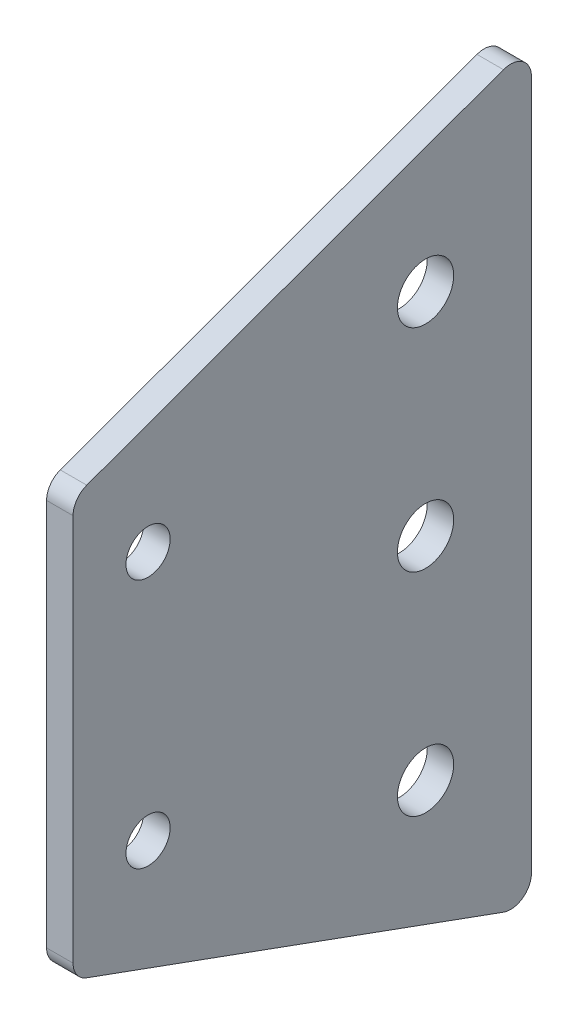
ISO-10303-21;
HEADER;
FILE_DESCRIPTION(('STEP AP214'),'2;1');
FILE_NAME('part.step','',(''),(''),'','','');
FILE_SCHEMA(('AUTOMOTIVE_DESIGN { 1 0 10303 214 1 1 1 1 }'));
ENDSEC;
DATA;
#1=APPLICATION_CONTEXT('core data for automotive mechanical design processes');
#2=APPLICATION_PROTOCOL_DEFINITION('international standard','automotive_design',2000,#1);
#3=PRODUCT_CONTEXT('',#1,'mechanical');
#4=PRODUCT('Part','Part','',(#3));
#5=PRODUCT_RELATED_PRODUCT_CATEGORY('part','',(#4));
#6=PRODUCT_DEFINITION_FORMATION('','',#4);
#7=PRODUCT_DEFINITION_CONTEXT('part definition',#1,'design');
#8=PRODUCT_DEFINITION('design','',#6,#7);
#9=PRODUCT_DEFINITION_SHAPE('','',#8);
#10=(LENGTH_UNIT() NAMED_UNIT(*) SI_UNIT(.MILLI.,.METRE.));
#11=(NAMED_UNIT(*) PLANE_ANGLE_UNIT() SI_UNIT($,.RADIAN.));
#12=(NAMED_UNIT(*) SI_UNIT($,.STERADIAN.) SOLID_ANGLE_UNIT());
#13=UNCERTAINTY_MEASURE_WITH_UNIT(LENGTH_MEASURE(1.E-05),#10,'distance_accuracy_value','');
#14=(GEOMETRIC_REPRESENTATION_CONTEXT(3) GLOBAL_UNCERTAINTY_ASSIGNED_CONTEXT((#13)) GLOBAL_UNIT_ASSIGNED_CONTEXT((#10,
#11,#12)) REPRESENTATION_CONTEXT('',''));
#15=CARTESIAN_POINT('',(0.,0.,0.));
#16=DIRECTION('',(0.,0.,1.));
#17=DIRECTION('',(1.,0.,0.));
#18=AXIS2_PLACEMENT_3D('',#15,#16,#17);
#19=CARTESIAN_POINT('',(1.5875,0.,0.));
#20=DIRECTION('',(-1.,0.,0.));
#21=DIRECTION('',(0.,0.,1.));
#22=AXIS2_PLACEMENT_3D('',#19,#20,#21);
#23=PLANE('',#22);
#24=CARTESIAN_POINT('',(1.5875,25.4,-14.8));
#25=DIRECTION('',(1.,0.,0.));
#26=DIRECTION('',(0.,0.,-1.));
#27=AXIS2_PLACEMENT_3D('',#24,#25,#26);
#28=CIRCLE('',#27,3.3782);
#29=CARTESIAN_POINT('',(1.5875,25.4,-18.1782));
#30=VERTEX_POINT('',#29);
#31=EDGE_CURVE('E415',#30,#30,#28,.T.);
#32=ORIENTED_EDGE('',*,*,#31,.F.);
#33=EDGE_LOOP('',(#32));
#34=FACE_BOUND('',#33,.T.);
#35=CARTESIAN_POINT('',(1.5875,15.,18.5));
#36=DIRECTION('',(1.,0.,0.));
#37=DIRECTION('',(0.,0.,-1.));
#38=AXIS2_PLACEMENT_3D('',#35,#36,#37);
#39=CIRCLE('',#38,2.64999999999999);
#40=CARTESIAN_POINT('',(1.5875,15.,15.85));
#41=VERTEX_POINT('',#40);
#42=EDGE_CURVE('E239',#41,#41,#39,.T.);
#43=ORIENTED_EDGE('',*,*,#42,.F.);
#44=EDGE_LOOP('',(#43));
#45=FACE_BOUND('',#44,.T.);
#46=CARTESIAN_POINT('',(1.5875,-15.,18.5));
#47=DIRECTION('',(1.,0.,0.));
#48=DIRECTION('',(0.,0.,-1.));
#49=AXIS2_PLACEMENT_3D('',#46,#47,#48);
#50=CIRCLE('',#49,2.64999999999999);
#51=CARTESIAN_POINT('',(1.5875,-15.,15.85));
#52=VERTEX_POINT('',#51);
#53=EDGE_CURVE('E157',#52,#52,#50,.T.);
#54=ORIENTED_EDGE('',*,*,#53,.F.);
#55=EDGE_LOOP('',(#54));
#56=FACE_BOUND('',#55,.T.);
#57=DIRECTION('',(0.,1.,0.));
#58=VECTOR('',#57,1.);
#59=CARTESIAN_POINT('',(1.5875,45.,-27.5));
#60=LINE('',#59,#58);
#61=CARTESIAN_POINT('',(1.5875,-41.430750020291,-27.5));
#62=VERTEX_POINT('',#61);
#63=CARTESIAN_POINT('',(1.5875,41.430750020291,-27.5));
#64=VERTEX_POINT('',#63);
#65=EDGE_CURVE('E160',#62,#64,#60,.T.);
#66=ORIENTED_EDGE('',*,*,#65,.T.);
#67=CARTESIAN_POINT('',(1.5875,41.430750020291,-25.));
#68=DIRECTION('',(-1.,0.,0.));
#69=DIRECTION('',(0.,0.,1.));
#70=AXIS2_PLACEMENT_3D('',#67,#68,#69);
#71=CIRCLE('',#70,2.5);
#72=CARTESIAN_POINT('',(1.5875,43.7802335790121,-24.1456423422832));
#73=VERTEX_POINT('',#72);
#74=EDGE_CURVE('E191',#64,#73,#71,.F.);
#75=ORIENTED_EDGE('',*,*,#74,.T.);
#76=DIRECTION('',(0.,-0.341743063086704,0.939793423488437));
#77=VECTOR('',#76,1.);
#78=CARTESIAN_POINT('',(1.5875,25.,27.5));
#79=LINE('',#78,#77);
#80=CARTESIAN_POINT('',(1.5875,25.5984153971939,25.8543576577168));
#81=VERTEX_POINT('',#80);
#82=EDGE_CURVE('E140',#73,#81,#79,.T.);
#83=ORIENTED_EDGE('',*,*,#82,.T.);
#84=CARTESIAN_POINT('',(1.5875,23.2489318384728,25.));
#85=DIRECTION('',(-1.,0.,0.));
#86=DIRECTION('',(0.,0.,1.));
#87=AXIS2_PLACEMENT_3D('',#84,#85,#86);
#88=CIRCLE('',#87,2.5);
#89=CARTESIAN_POINT('',(1.5875,23.2489318384728,27.5));
#90=VERTEX_POINT('',#89);
#91=EDGE_CURVE('E183',#81,#90,#88,.F.);
#92=ORIENTED_EDGE('',*,*,#91,.T.);
#93=DIRECTION('',(0.,-1.,0.));
#94=VECTOR('',#93,1.);
#95=CARTESIAN_POINT('',(1.5875,25.,27.5));
#96=LINE('',#95,#94);
#97=CARTESIAN_POINT('',(1.5875,-23.2489318384728,27.5));
#98=VERTEX_POINT('',#97);
#99=EDGE_CURVE('E206',#90,#98,#96,.T.);
#100=ORIENTED_EDGE('',*,*,#99,.T.);
#101=CARTESIAN_POINT('',(1.5875,-23.2489318384728,25.));
#102=DIRECTION('',(-1.,0.,0.));
#103=DIRECTION('',(0.,0.,1.));
#104=AXIS2_PLACEMENT_3D('',#101,#102,#103);
#105=CIRCLE('',#104,2.5);
#106=CARTESIAN_POINT('',(1.5875,-25.5984153971939,25.8543576577168));
#107=VERTEX_POINT('',#106);
#108=EDGE_CURVE('E75',#98,#107,#105,.F.);
#109=ORIENTED_EDGE('',*,*,#108,.T.);
#110=DIRECTION('',(0.,-0.341743063086704,-0.939793423488437));
#111=VECTOR('',#110,1.);
#112=CARTESIAN_POINT('',(1.5875,-25.,27.5));
#113=LINE('',#112,#111);
#114=CARTESIAN_POINT('',(1.5875,-43.7802335790121,-24.1456423422832));
#115=VERTEX_POINT('',#114);
#116=EDGE_CURVE('E214',#107,#115,#113,.T.);
#117=ORIENTED_EDGE('',*,*,#116,.T.);
#118=CARTESIAN_POINT('',(1.5875,-41.430750020291,-25.));
#119=DIRECTION('',(-1.,0.,0.));
#120=DIRECTION('',(0.,0.,1.));
#121=AXIS2_PLACEMENT_3D('',#118,#119,#120);
#122=CIRCLE('',#121,2.5);
#123=EDGE_CURVE('E188',#115,#62,#122,.F.);
#124=ORIENTED_EDGE('',*,*,#123,.T.);
#125=EDGE_LOOP('',(#66,#75,#83,#92,#100,#109,#117,#124));
#126=FACE_BOUND('',#125,.T.);
#127=CARTESIAN_POINT('',(1.5875,-25.4,-14.8));
#128=DIRECTION('',(1.,0.,0.));
#129=DIRECTION('',(0.,0.,-1.));
#130=AXIS2_PLACEMENT_3D('',#127,#128,#129);
#131=CIRCLE('',#130,3.3782);
#132=CARTESIAN_POINT('',(1.5875,-25.4,-18.1782));
#133=VERTEX_POINT('',#132);
#134=EDGE_CURVE('E228',#133,#133,#131,.T.);
#135=ORIENTED_EDGE('',*,*,#134,.F.);
#136=EDGE_LOOP('',(#135));
#137=FACE_BOUND('',#136,.T.);
#138=CARTESIAN_POINT('',(1.5875,0.,-14.8));
#139=DIRECTION('',(1.,0.,0.));
#140=DIRECTION('',(0.,0.,-1.));
#141=AXIS2_PLACEMENT_3D('',#138,#139,#140);
#142=CIRCLE('',#141,3.3782);
#143=CARTESIAN_POINT('',(1.5875,0.,-18.1782));
#144=VERTEX_POINT('',#143);
#145=EDGE_CURVE('E409',#144,#144,#142,.T.);
#146=ORIENTED_EDGE('',*,*,#145,.F.);
#147=EDGE_LOOP('',(#146));
#148=FACE_BOUND('',#147,.T.);
#149=ADVANCED_FACE('F52',(#34,#45,#56,#126,#137,#148),#23,.F.);
#150=CARTESIAN_POINT('',(1.5875,25.,27.5));
#151=DIRECTION('',(0.,-0.939793423488437,-0.341743063086704));
#152=DIRECTION('',(0.,0.341743063086704,-0.939793423488437));
#153=AXIS2_PLACEMENT_3D('',#150,#151,#152);
#154=PLANE('',#153);
#155=ORIENTED_EDGE('',*,*,#82,.F.);
#156=DIRECTION('',(-1.,0.,0.));
#157=VECTOR('',#156,1.);
#158=CARTESIAN_POINT('',(1.5875,43.7802335790121,-24.1456423422833));
#159=LINE('',#158,#157);
#160=CARTESIAN_POINT('',(-1.5875,43.7802335790121,-24.1456423422832));
#161=VERTEX_POINT('',#160);
#162=EDGE_CURVE('E123',#73,#161,#159,.T.);
#163=ORIENTED_EDGE('',*,*,#162,.T.);
#164=DIRECTION('',(0.,-0.341743063086704,0.939793423488437));
#165=VECTOR('',#164,1.);
#166=CARTESIAN_POINT('',(-1.5875,25.,27.5));
#167=LINE('',#166,#165);
#168=CARTESIAN_POINT('',(-1.5875,25.5984153971939,25.8543576577168));
#169=VERTEX_POINT('',#168);
#170=EDGE_CURVE('E137',#161,#169,#167,.T.);
#171=ORIENTED_EDGE('',*,*,#170,.T.);
#172=DIRECTION('',(-1.,0.,0.));
#173=VECTOR('',#172,1.);
#174=CARTESIAN_POINT('',(1.5875,25.5984153971939,25.8543576577168));
#175=LINE('',#174,#173);
#176=EDGE_CURVE('E143',#169,#81,#175,.F.);
#177=ORIENTED_EDGE('',*,*,#176,.T.);
#178=EDGE_LOOP('',(#155,#163,#171,#177));
#179=FACE_BOUND('',#178,.T.);
#180=ADVANCED_FACE('F136',(#179),#154,.F.);
#181=CARTESIAN_POINT('',(1.5875,25.,27.5));
#182=DIRECTION('',(0.,0.,-1.));
#183=DIRECTION('',(-1.,0.,0.));
#184=AXIS2_PLACEMENT_3D('',#181,#182,#183);
#185=PLANE('',#184);
#186=DIRECTION('',(0.,-1.,0.));
#187=VECTOR('',#186,1.);
#188=CARTESIAN_POINT('',(-1.5875,25.,27.5));
#189=LINE('',#188,#187);
#190=CARTESIAN_POINT('',(-1.5875,23.2489318384728,27.5));
#191=VERTEX_POINT('',#190);
#192=CARTESIAN_POINT('',(-1.5875,-23.2489318384728,27.5));
#193=VERTEX_POINT('',#192);
#194=EDGE_CURVE('E148',#191,#193,#189,.T.);
#195=ORIENTED_EDGE('',*,*,#194,.T.);
#196=DIRECTION('',(-1.,0.,0.));
#197=VECTOR('',#196,1.);
#198=CARTESIAN_POINT('',(1.5875,-23.2489318384728,27.5));
#199=LINE('',#198,#197);
#200=EDGE_CURVE('E12',#193,#98,#199,.F.);
#201=ORIENTED_EDGE('',*,*,#200,.T.);
#202=ORIENTED_EDGE('',*,*,#99,.F.);
#203=DIRECTION('',(-1.,0.,0.));
#204=VECTOR('',#203,1.);
#205=CARTESIAN_POINT('',(1.5875,23.2489318384728,27.5));
#206=LINE('',#205,#204);
#207=EDGE_CURVE('E61',#90,#191,#206,.T.);
#208=ORIENTED_EDGE('',*,*,#207,.T.);
#209=EDGE_LOOP('',(#195,#201,#202,#208));
#210=FACE_BOUND('',#209,.T.);
#211=ADVANCED_FACE('F204',(#210),#185,.F.);
#212=CARTESIAN_POINT('',(1.5875,-25.,27.5));
#213=DIRECTION('',(0.,0.939793423488437,-0.341743063086704));
#214=DIRECTION('',(0.,0.341743063086704,0.939793423488437));
#215=AXIS2_PLACEMENT_3D('',#212,#213,#214);
#216=PLANE('',#215);
#217=DIRECTION('',(0.,-0.341743063086704,-0.939793423488437));
#218=VECTOR('',#217,1.);
#219=CARTESIAN_POINT('',(-1.5875,-25.,27.5));
#220=LINE('',#219,#218);
#221=CARTESIAN_POINT('',(-1.5875,-25.5984153971939,25.8543576577168));
#222=VERTEX_POINT('',#221);
#223=CARTESIAN_POINT('',(-1.5875,-43.7802335790121,-24.1456423422832));
#224=VERTEX_POINT('',#223);
#225=EDGE_CURVE('E154',#222,#224,#220,.T.);
#226=ORIENTED_EDGE('',*,*,#225,.T.);
#227=DIRECTION('',(-1.,0.,0.));
#228=VECTOR('',#227,1.);
#229=CARTESIAN_POINT('',(1.5875,-43.7802335790121,-24.1456423422833));
#230=LINE('',#229,#228);
#231=EDGE_CURVE('E68',#224,#115,#230,.F.);
#232=ORIENTED_EDGE('',*,*,#231,.T.);
#233=ORIENTED_EDGE('',*,*,#116,.F.);
#234=DIRECTION('',(-1.,0.,0.));
#235=VECTOR('',#234,1.);
#236=CARTESIAN_POINT('',(1.5875,-25.5984153971939,25.8543576577168));
#237=LINE('',#236,#235);
#238=EDGE_CURVE('E194',#107,#222,#237,.T.);
#239=ORIENTED_EDGE('',*,*,#238,.T.);
#240=EDGE_LOOP('',(#226,#232,#233,#239));
#241=FACE_BOUND('',#240,.T.);
#242=ADVANCED_FACE('F213',(#241),#216,.F.);
#243=CARTESIAN_POINT('',(1.5875,45.,-27.5));
#244=DIRECTION('',(0.,0.,1.));
#245=DIRECTION('',(1.,0.,0.));
#246=AXIS2_PLACEMENT_3D('',#243,#244,#245);
#247=PLANE('',#246);
#248=DIRECTION('',(0.,1.,0.));
#249=VECTOR('',#248,1.);
#250=CARTESIAN_POINT('',(-1.5875,45.,-27.5));
#251=LINE('',#250,#249);
#252=CARTESIAN_POINT('',(-1.5875,-41.430750020291,-27.5));
#253=VERTEX_POINT('',#252);
#254=CARTESIAN_POINT('',(-1.5875,41.430750020291,-27.5));
#255=VERTEX_POINT('',#254);
#256=EDGE_CURVE('E166',#253,#255,#251,.T.);
#257=ORIENTED_EDGE('',*,*,#256,.T.);
#258=DIRECTION('',(-1.,0.,0.));
#259=VECTOR('',#258,1.);
#260=CARTESIAN_POINT('',(1.5875,41.430750020291,-27.5));
#261=LINE('',#260,#259);
#262=EDGE_CURVE('E124',#255,#64,#261,.F.);
#263=ORIENTED_EDGE('',*,*,#262,.T.);
#264=ORIENTED_EDGE('',*,*,#65,.F.);
#265=DIRECTION('',(-1.,0.,0.));
#266=VECTOR('',#265,1.);
#267=CARTESIAN_POINT('',(1.5875,-41.430750020291,-27.5));
#268=LINE('',#267,#266);
#269=EDGE_CURVE('E130',#62,#253,#268,.T.);
#270=ORIENTED_EDGE('',*,*,#269,.T.);
#271=EDGE_LOOP('',(#257,#263,#264,#270));
#272=FACE_BOUND('',#271,.T.);
#273=ADVANCED_FACE('F278',(#272),#247,.F.);
#274=CARTESIAN_POINT('',(-1.5875,0.,0.));
#275=DIRECTION('',(-1.,0.,0.));
#276=DIRECTION('',(0.,0.,1.));
#277=AXIS2_PLACEMENT_3D('',#274,#275,#276);
#278=PLANE('',#277);
#279=CARTESIAN_POINT('',(-1.5875,25.4,-14.8));
#280=DIRECTION('',(-1.,0.,0.));
#281=DIRECTION('',(0.,0.,1.));
#282=AXIS2_PLACEMENT_3D('',#279,#280,#281);
#283=CIRCLE('',#282,3.3782);
#284=CARTESIAN_POINT('',(-1.5875,25.4,-11.4218));
#285=VERTEX_POINT('',#284);
#286=EDGE_CURVE('E412',#285,#285,#283,.T.);
#287=ORIENTED_EDGE('',*,*,#286,.F.);
#288=EDGE_LOOP('',(#287));
#289=FACE_BOUND('',#288,.T.);
#290=CARTESIAN_POINT('',(-1.5875,0.,-14.8));
#291=DIRECTION('',(-1.,0.,0.));
#292=DIRECTION('',(0.,0.,1.));
#293=AXIS2_PLACEMENT_3D('',#290,#291,#292);
#294=CIRCLE('',#293,3.3782);
#295=CARTESIAN_POINT('',(-1.5875,0.,-11.4218));
#296=VERTEX_POINT('',#295);
#297=EDGE_CURVE('E235',#296,#296,#294,.T.);
#298=ORIENTED_EDGE('',*,*,#297,.F.);
#299=EDGE_LOOP('',(#298));
#300=FACE_BOUND('',#299,.T.);
#301=CARTESIAN_POINT('',(-1.5875,-25.4,-14.8));
#302=DIRECTION('',(-1.,0.,0.));
#303=DIRECTION('',(0.,0.,1.));
#304=AXIS2_PLACEMENT_3D('',#301,#302,#303);
#305=CIRCLE('',#304,3.3782);
#306=CARTESIAN_POINT('',(-1.5875,-25.4,-11.4218));
#307=VERTEX_POINT('',#306);
#308=EDGE_CURVE('E234',#307,#307,#305,.T.);
#309=ORIENTED_EDGE('',*,*,#308,.F.);
#310=EDGE_LOOP('',(#309));
#311=FACE_BOUND('',#310,.T.);
#312=CARTESIAN_POINT('',(-1.5875,15.,18.5));
#313=DIRECTION('',(-1.,0.,0.));
#314=DIRECTION('',(0.,0.,1.));
#315=AXIS2_PLACEMENT_3D('',#312,#313,#314);
#316=CIRCLE('',#315,2.64999999999999);
#317=CARTESIAN_POINT('',(-1.5875,15.,21.15));
#318=VERTEX_POINT('',#317);
#319=EDGE_CURVE('E244',#318,#318,#316,.T.);
#320=ORIENTED_EDGE('',*,*,#319,.F.);
#321=EDGE_LOOP('',(#320));
#322=FACE_BOUND('',#321,.T.);
#323=CARTESIAN_POINT('',(-1.5875,-15.,18.5));
#324=DIRECTION('',(-1.,0.,0.));
#325=DIRECTION('',(0.,0.,1.));
#326=AXIS2_PLACEMENT_3D('',#323,#324,#325);
#327=CIRCLE('',#326,2.64999999999999);
#328=CARTESIAN_POINT('',(-1.5875,-15.,21.15));
#329=VERTEX_POINT('',#328);
#330=EDGE_CURVE('E149',#329,#329,#327,.T.);
#331=ORIENTED_EDGE('',*,*,#330,.F.);
#332=EDGE_LOOP('',(#331));
#333=FACE_BOUND('',#332,.T.);
#334=ORIENTED_EDGE('',*,*,#170,.F.);
#335=CARTESIAN_POINT('',(-1.5875,41.430750020291,-25.));
#336=DIRECTION('',(-1.,0.,0.));
#337=DIRECTION('',(0.,0.,1.));
#338=AXIS2_PLACEMENT_3D('',#335,#336,#337);
#339=CIRCLE('',#338,2.5);
#340=EDGE_CURVE('E119',#161,#255,#339,.T.);
#341=ORIENTED_EDGE('',*,*,#340,.T.);
#342=ORIENTED_EDGE('',*,*,#256,.F.);
#343=CARTESIAN_POINT('',(-1.5875,-41.430750020291,-25.));
#344=DIRECTION('',(-1.,0.,0.));
#345=DIRECTION('',(0.,0.,1.));
#346=AXIS2_PLACEMENT_3D('',#343,#344,#345);
#347=CIRCLE('',#346,2.5);
#348=EDGE_CURVE('E131',#253,#224,#347,.T.);
#349=ORIENTED_EDGE('',*,*,#348,.T.);
#350=ORIENTED_EDGE('',*,*,#225,.F.);
#351=CARTESIAN_POINT('',(-1.5875,-23.2489318384728,25.));
#352=DIRECTION('',(-1.,0.,0.));
#353=DIRECTION('',(0.,0.,1.));
#354=AXIS2_PLACEMENT_3D('',#351,#352,#353);
#355=CIRCLE('',#354,2.5);
#356=EDGE_CURVE('E173',#222,#193,#355,.T.);
#357=ORIENTED_EDGE('',*,*,#356,.T.);
#358=ORIENTED_EDGE('',*,*,#194,.F.);
#359=CARTESIAN_POINT('',(-1.5875,23.2489318384728,25.));
#360=DIRECTION('',(-1.,0.,0.));
#361=DIRECTION('',(0.,0.,1.));
#362=AXIS2_PLACEMENT_3D('',#359,#360,#361);
#363=CIRCLE('',#362,2.5);
#364=EDGE_CURVE('E142',#191,#169,#363,.T.);
#365=ORIENTED_EDGE('',*,*,#364,.T.);
#366=EDGE_LOOP('',(#334,#341,#342,#349,#350,#357,#358,#365));
#367=FACE_BOUND('',#366,.T.);
#368=ADVANCED_FACE('F145',(#289,#300,#311,#322,#333,#367),#278,.T.);
#369=CARTESIAN_POINT('',(1.5875,-15.,18.5));
#370=DIRECTION('',(1.,0.,0.));
#371=DIRECTION('',(0.,0.,-1.));
#372=AXIS2_PLACEMENT_3D('',#369,#370,#371);
#373=CYLINDRICAL_SURFACE('',#372,2.64999999999999);
#374=ORIENTED_EDGE('',*,*,#53,.T.);
#375=EDGE_LOOP('',(#374));
#376=FACE_BOUND('',#375,.T.);
#377=ORIENTED_EDGE('',*,*,#330,.T.);
#378=EDGE_LOOP('',(#377));
#379=FACE_BOUND('',#378,.T.);
#380=ADVANCED_FACE('F274',(#376,#379),#373,.F.);
#381=CARTESIAN_POINT('',(1.5875,15.,18.5));
#382=DIRECTION('',(1.,0.,0.));
#383=DIRECTION('',(0.,0.,-1.));
#384=AXIS2_PLACEMENT_3D('',#381,#382,#383);
#385=CYLINDRICAL_SURFACE('',#384,2.64999999999999);
#386=ORIENTED_EDGE('',*,*,#42,.T.);
#387=EDGE_LOOP('',(#386));
#388=FACE_BOUND('',#387,.T.);
#389=ORIENTED_EDGE('',*,*,#319,.T.);
#390=EDGE_LOOP('',(#389));
#391=FACE_BOUND('',#390,.T.);
#392=ADVANCED_FACE('F338',(#388,#391),#385,.F.);
#393=CARTESIAN_POINT('',(1.5875,-25.4,-14.8));
#394=DIRECTION('',(1.,0.,0.));
#395=DIRECTION('',(0.,0.,-1.));
#396=AXIS2_PLACEMENT_3D('',#393,#394,#395);
#397=CYLINDRICAL_SURFACE('',#396,3.3782);
#398=ORIENTED_EDGE('',*,*,#134,.T.);
#399=EDGE_LOOP('',(#398));
#400=FACE_BOUND('',#399,.T.);
#401=ORIENTED_EDGE('',*,*,#308,.T.);
#402=EDGE_LOOP('',(#401));
#403=FACE_BOUND('',#402,.T.);
#404=ADVANCED_FACE('F329',(#400,#403),#397,.F.);
#405=CARTESIAN_POINT('',(1.5875,0.,-14.8));
#406=DIRECTION('',(1.,0.,0.));
#407=DIRECTION('',(0.,0.,-1.));
#408=AXIS2_PLACEMENT_3D('',#405,#406,#407);
#409=CYLINDRICAL_SURFACE('',#408,3.3782);
#410=ORIENTED_EDGE('',*,*,#145,.T.);
#411=EDGE_LOOP('',(#410));
#412=FACE_BOUND('',#411,.T.);
#413=ORIENTED_EDGE('',*,*,#297,.T.);
#414=EDGE_LOOP('',(#413));
#415=FACE_BOUND('',#414,.T.);
#416=ADVANCED_FACE('F320',(#412,#415),#409,.F.);
#417=CARTESIAN_POINT('',(1.5875,25.4,-14.8));
#418=DIRECTION('',(1.,0.,0.));
#419=DIRECTION('',(0.,0.,-1.));
#420=AXIS2_PLACEMENT_3D('',#417,#418,#419);
#421=CYLINDRICAL_SURFACE('',#420,3.3782);
#422=ORIENTED_EDGE('',*,*,#31,.T.);
#423=EDGE_LOOP('',(#422));
#424=FACE_BOUND('',#423,.T.);
#425=ORIENTED_EDGE('',*,*,#286,.T.);
#426=EDGE_LOOP('',(#425));
#427=FACE_BOUND('',#426,.T.);
#428=ADVANCED_FACE('F289',(#424,#427),#421,.F.);
#429=CARTESIAN_POINT('',(1.5875,41.430750020291,-25.));
#430=DIRECTION('',(-1.,0.,0.));
#431=DIRECTION('',(0.,0.,1.));
#432=AXIS2_PLACEMENT_3D('',#429,#430,#431);
#433=CYLINDRICAL_SURFACE('',#432,2.5);
#434=ORIENTED_EDGE('',*,*,#74,.F.);
#435=ORIENTED_EDGE('',*,*,#262,.F.);
#436=ORIENTED_EDGE('',*,*,#340,.F.);
#437=ORIENTED_EDGE('',*,*,#162,.F.);
#438=EDGE_LOOP('',(#434,#435,#436,#437));
#439=FACE_BOUND('',#438,.T.);
#440=ADVANCED_FACE('F122',(#439),#433,.T.);
#441=CARTESIAN_POINT('',(1.5875,-41.430750020291,-25.));
#442=DIRECTION('',(-1.,0.,0.));
#443=DIRECTION('',(0.,0.,1.));
#444=AXIS2_PLACEMENT_3D('',#441,#442,#443);
#445=CYLINDRICAL_SURFACE('',#444,2.5);
#446=ORIENTED_EDGE('',*,*,#123,.F.);
#447=ORIENTED_EDGE('',*,*,#231,.F.);
#448=ORIENTED_EDGE('',*,*,#348,.F.);
#449=ORIENTED_EDGE('',*,*,#269,.F.);
#450=EDGE_LOOP('',(#446,#447,#448,#449));
#451=FACE_BOUND('',#450,.T.);
#452=ADVANCED_FACE('F261',(#451),#445,.T.);
#453=CARTESIAN_POINT('',(1.5875,-23.2489318384728,25.));
#454=DIRECTION('',(-1.,0.,0.));
#455=DIRECTION('',(0.,0.,1.));
#456=AXIS2_PLACEMENT_3D('',#453,#454,#455);
#457=CYLINDRICAL_SURFACE('',#456,2.5);
#458=ORIENTED_EDGE('',*,*,#108,.F.);
#459=ORIENTED_EDGE('',*,*,#200,.F.);
#460=ORIENTED_EDGE('',*,*,#356,.F.);
#461=ORIENTED_EDGE('',*,*,#238,.F.);
#462=EDGE_LOOP('',(#458,#459,#460,#461));
#463=FACE_BOUND('',#462,.T.);
#464=ADVANCED_FACE('F212',(#463),#457,.T.);
#465=CARTESIAN_POINT('',(1.5875,23.2489318384728,25.));
#466=DIRECTION('',(-1.,0.,0.));
#467=DIRECTION('',(0.,0.,1.));
#468=AXIS2_PLACEMENT_3D('',#465,#466,#467);
#469=CYLINDRICAL_SURFACE('',#468,2.5);
#470=ORIENTED_EDGE('',*,*,#91,.F.);
#471=ORIENTED_EDGE('',*,*,#176,.F.);
#472=ORIENTED_EDGE('',*,*,#364,.F.);
#473=ORIENTED_EDGE('',*,*,#207,.F.);
#474=EDGE_LOOP('',(#470,#471,#472,#473));
#475=FACE_BOUND('',#474,.T.);
#476=ADVANCED_FACE('F54',(#475),#469,.T.);
#477=CLOSED_SHELL('',(#149,#180,#211,#242,#273,#368,#380,#392,#404,#416,#428,#440,#452,#464,#476));
#478=MANIFOLD_SOLID_BREP('B2',#477);
#479=ADVANCED_BREP_SHAPE_REPRESENTATION('',(#18,#478),#14);
#480=SHAPE_DEFINITION_REPRESENTATION(#9,#479);
ENDSEC;
END-ISO-10303-21;
